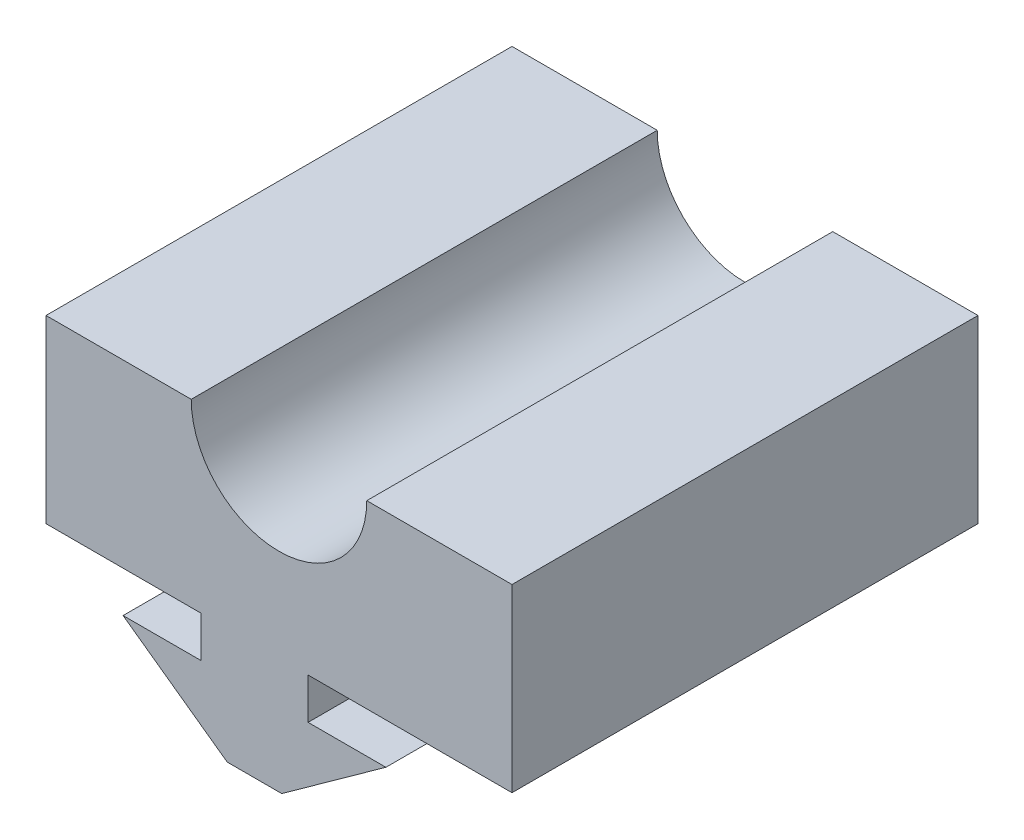
ISO-10303-21;
HEADER;
FILE_DESCRIPTION(('STEP AP214'),'2;1');
FILE_NAME('part.step','',(''),(''),'','','');
FILE_SCHEMA(('AUTOMOTIVE_DESIGN { 1 0 10303 214 1 1 1 1 }'));
ENDSEC;
DATA;
#1=APPLICATION_CONTEXT('core data for automotive mechanical design processes');
#2=APPLICATION_PROTOCOL_DEFINITION('international standard','automotive_design',2000,#1);
#3=PRODUCT_CONTEXT('',#1,'mechanical');
#4=PRODUCT('Part','Part','',(#3));
#5=PRODUCT_RELATED_PRODUCT_CATEGORY('part','',(#4));
#6=PRODUCT_DEFINITION_FORMATION('','',#4);
#7=PRODUCT_DEFINITION_CONTEXT('part definition',#1,'design');
#8=PRODUCT_DEFINITION('design','',#6,#7);
#9=PRODUCT_DEFINITION_SHAPE('','',#8);
#10=(LENGTH_UNIT() NAMED_UNIT(*) SI_UNIT(.MILLI.,.METRE.));
#11=(NAMED_UNIT(*) PLANE_ANGLE_UNIT() SI_UNIT($,.RADIAN.));
#12=(NAMED_UNIT(*) SI_UNIT($,.STERADIAN.) SOLID_ANGLE_UNIT());
#13=UNCERTAINTY_MEASURE_WITH_UNIT(LENGTH_MEASURE(1.E-05),#10,'distance_accuracy_value','');
#14=(GEOMETRIC_REPRESENTATION_CONTEXT(3) GLOBAL_UNCERTAINTY_ASSIGNED_CONTEXT((#13)) GLOBAL_UNIT_ASSIGNED_CONTEXT((#10,
#11,#12)) REPRESENTATION_CONTEXT('',''));
#15=CARTESIAN_POINT('',(0.,0.,0.));
#16=DIRECTION('',(0.,0.,1.));
#17=DIRECTION('',(1.,0.,0.));
#18=AXIS2_PLACEMENT_3D('',#15,#16,#17);
#19=CARTESIAN_POINT('',(0.,0.,25.4));
#20=DIRECTION('',(1.,0.,0.));
#21=DIRECTION('',(0.,0.,-1.));
#22=AXIS2_PLACEMENT_3D('',#19,#20,#21);
#23=PLANE('',#22);
#24=DIRECTION('',(0.,-1.,0.));
#25=VECTOR('',#24,1.);
#26=CARTESIAN_POINT('',(0.,0.,0.));
#27=LINE('',#26,#25);
#28=CARTESIAN_POINT('',(0.,9.8294520547945,0.));
#29=VERTEX_POINT('',#28);
#30=CARTESIAN_POINT('',(0.,0.,0.));
#31=VERTEX_POINT('',#30);
#32=EDGE_CURVE('E180',#29,#31,#27,.T.);
#33=ORIENTED_EDGE('',*,*,#32,.T.);
#34=DIRECTION('',(0.,0.,-1.));
#35=VECTOR('',#34,1.);
#36=CARTESIAN_POINT('',(0.,0.,25.4));
#37=LINE('',#36,#35);
#38=CARTESIAN_POINT('',(0.,0.,25.4));
#39=VERTEX_POINT('',#38);
#40=EDGE_CURVE('E11',#39,#31,#37,.T.);
#41=ORIENTED_EDGE('',*,*,#40,.F.);
#42=DIRECTION('',(0.,-1.,0.));
#43=VECTOR('',#42,1.);
#44=CARTESIAN_POINT('',(0.,0.,25.4));
#45=LINE('',#44,#43);
#46=CARTESIAN_POINT('',(0.,9.8294520547945,25.4));
#47=VERTEX_POINT('',#46);
#48=EDGE_CURVE('E220',#47,#39,#45,.T.);
#49=ORIENTED_EDGE('',*,*,#48,.F.);
#50=DIRECTION('',(0.,0.,-1.));
#51=VECTOR('',#50,1.);
#52=CARTESIAN_POINT('',(0.,9.8294520547945,25.4));
#53=LINE('',#52,#51);
#54=EDGE_CURVE('E176',#47,#29,#53,.T.);
#55=ORIENTED_EDGE('',*,*,#54,.T.);
#56=EDGE_LOOP('',(#33,#41,#49,#55));
#57=FACE_BOUND('',#56,.T.);
#58=ADVANCED_FACE('F43',(#57),#23,.F.);
#59=CARTESIAN_POINT('',(0.,0.,25.4));
#60=DIRECTION('',(0.,1.,0.));
#61=DIRECTION('',(0.,0.,1.));
#62=AXIS2_PLACEMENT_3D('',#59,#60,#61);
#63=PLANE('',#62);
#64=DIRECTION('',(1.,0.,0.));
#65=VECTOR('',#64,1.);
#66=CARTESIAN_POINT('',(0.,0.,0.));
#67=LINE('',#66,#65);
#68=CARTESIAN_POINT('',(8.44304869159382,0.,0.));
#69=VERTEX_POINT('',#68);
#70=EDGE_CURVE('E184',#31,#69,#67,.T.);
#71=ORIENTED_EDGE('',*,*,#70,.T.);
#72=DIRECTION('',(0.,0.,-1.));
#73=VECTOR('',#72,1.);
#74=CARTESIAN_POINT('',(8.44304869159382,0.,25.4));
#75=LINE('',#74,#73);
#76=CARTESIAN_POINT('',(8.44304869159382,0.,25.4));
#77=VERTEX_POINT('',#76);
#78=EDGE_CURVE('E52',#77,#69,#75,.T.);
#79=ORIENTED_EDGE('',*,*,#78,.F.);
#80=DIRECTION('',(1.,0.,0.));
#81=VECTOR('',#80,1.);
#82=CARTESIAN_POINT('',(0.,0.,25.4));
#83=LINE('',#82,#81);
#84=EDGE_CURVE('E121',#39,#77,#83,.T.);
#85=ORIENTED_EDGE('',*,*,#84,.F.);
#86=ORIENTED_EDGE('',*,*,#40,.T.);
#87=EDGE_LOOP('',(#71,#79,#85,#86));
#88=FACE_BOUND('',#87,.T.);
#89=ADVANCED_FACE('F328',(#88),#63,.F.);
#90=CARTESIAN_POINT('',(8.44304869159382,-2.2352,25.4));
#91=DIRECTION('',(1.,0.,0.));
#92=DIRECTION('',(0.,1.,0.));
#93=AXIS2_PLACEMENT_3D('',#90,#91,#92);
#94=PLANE('',#93);
#95=DIRECTION('',(0.,-1.,0.));
#96=VECTOR('',#95,1.);
#97=CARTESIAN_POINT('',(8.44304869159382,-2.2352,0.));
#98=LINE('',#97,#96);
#99=CARTESIAN_POINT('',(8.44304869159382,-2.2352,0.));
#100=VERTEX_POINT('',#99);
#101=EDGE_CURVE('E187',#69,#100,#98,.T.);
#102=ORIENTED_EDGE('',*,*,#101,.T.);
#103=DIRECTION('',(0.,0.,-1.));
#104=VECTOR('',#103,1.);
#105=CARTESIAN_POINT('',(8.44304869159382,-2.2352,25.4));
#106=LINE('',#105,#104);
#107=CARTESIAN_POINT('',(8.44304869159382,-2.2352,25.4));
#108=VERTEX_POINT('',#107);
#109=EDGE_CURVE('E255',#108,#100,#106,.T.);
#110=ORIENTED_EDGE('',*,*,#109,.F.);
#111=DIRECTION('',(0.,-1.,0.));
#112=VECTOR('',#111,1.);
#113=CARTESIAN_POINT('',(8.44304869159382,-2.2352,25.4));
#114=LINE('',#113,#112);
#115=EDGE_CURVE('E265',#77,#108,#114,.T.);
#116=ORIENTED_EDGE('',*,*,#115,.F.);
#117=ORIENTED_EDGE('',*,*,#78,.T.);
#118=EDGE_LOOP('',(#102,#110,#116,#117));
#119=FACE_BOUND('',#118,.T.);
#120=ADVANCED_FACE('F263',(#119),#94,.F.);
#121=CARTESIAN_POINT('',(4.20124869159382,-2.2352,25.4));
#122=DIRECTION('',(0.,-1.,0.));
#123=DIRECTION('',(0.,0.,-1.));
#124=AXIS2_PLACEMENT_3D('',#121,#122,#123);
#125=PLANE('',#124);
#126=DIRECTION('',(-1.,0.,0.));
#127=VECTOR('',#126,1.);
#128=CARTESIAN_POINT('',(4.20124869159382,-2.2352,0.));
#129=LINE('',#128,#127);
#130=CARTESIAN_POINT('',(4.20124869159382,-2.2352,0.));
#131=VERTEX_POINT('',#130);
#132=EDGE_CURVE('E190',#100,#131,#129,.T.);
#133=ORIENTED_EDGE('',*,*,#132,.T.);
#134=DIRECTION('',(0.,0.,-1.));
#135=VECTOR('',#134,1.);
#136=CARTESIAN_POINT('',(4.20124869159382,-2.2352,25.4));
#137=LINE('',#136,#135);
#138=CARTESIAN_POINT('',(4.20124869159382,-2.2352,25.4));
#139=VERTEX_POINT('',#138);
#140=EDGE_CURVE('E251',#139,#131,#137,.T.);
#141=ORIENTED_EDGE('',*,*,#140,.F.);
#142=DIRECTION('',(-1.,0.,0.));
#143=VECTOR('',#142,1.);
#144=CARTESIAN_POINT('',(4.20124869159382,-2.2352,25.4));
#145=LINE('',#144,#143);
#146=EDGE_CURVE('E284',#108,#139,#145,.T.);
#147=ORIENTED_EDGE('',*,*,#146,.F.);
#148=ORIENTED_EDGE('',*,*,#109,.T.);
#149=EDGE_LOOP('',(#133,#141,#147,#148));
#150=FACE_BOUND('',#149,.T.);
#151=ADVANCED_FACE('F274',(#150),#125,.F.);
#152=CARTESIAN_POINT('',(9.87814869159382,-6.31526088295004,25.4));
#153=DIRECTION('',(0.583616147877776,0.812029674295407,0.));
#154=DIRECTION('',(-0.812029674295408,0.583616147877776,0.));
#155=AXIS2_PLACEMENT_3D('',#152,#153,#154);
#156=PLANE('',#155);
#157=DIRECTION('',(0.812029674295407,-0.583616147877776,0.));
#158=VECTOR('',#157,1.);
#159=CARTESIAN_POINT('',(9.87814869159382,-6.31526088295004,0.));
#160=LINE('',#159,#158);
#161=CARTESIAN_POINT('',(9.87814869159382,-6.31526088295004,0.));
#162=VERTEX_POINT('',#161);
#163=EDGE_CURVE('E193',#131,#162,#160,.T.);
#164=ORIENTED_EDGE('',*,*,#163,.T.);
#165=DIRECTION('',(0.,0.,-1.));
#166=VECTOR('',#165,1.);
#167=CARTESIAN_POINT('',(9.87814869159382,-6.31526088295004,25.4));
#168=LINE('',#167,#166);
#169=CARTESIAN_POINT('',(9.87814869159382,-6.31526088295004,25.4));
#170=VERTEX_POINT('',#169);
#171=EDGE_CURVE('E247',#170,#162,#168,.T.);
#172=ORIENTED_EDGE('',*,*,#171,.F.);
#173=DIRECTION('',(0.812029674295407,-0.583616147877776,0.));
#174=VECTOR('',#173,1.);
#175=CARTESIAN_POINT('',(9.87814869159382,-6.31526088295004,25.4));
#176=LINE('',#175,#174);
#177=EDGE_CURVE('E280',#139,#170,#176,.T.);
#178=ORIENTED_EDGE('',*,*,#177,.F.);
#179=ORIENTED_EDGE('',*,*,#140,.T.);
#180=EDGE_LOOP('',(#164,#172,#178,#179));
#181=FACE_BOUND('',#180,.T.);
#182=ADVANCED_FACE('F278',(#181),#156,.F.);
#183=CARTESIAN_POINT('',(12.8499486915938,-6.31526088295004,25.4));
#184=DIRECTION('',(0.,1.,0.));
#185=DIRECTION('',(0.,0.,1.));
#186=AXIS2_PLACEMENT_3D('',#183,#184,#185);
#187=PLANE('',#186);
#188=DIRECTION('',(1.,0.,0.));
#189=VECTOR('',#188,1.);
#190=CARTESIAN_POINT('',(12.8499486915938,-6.31526088295004,0.));
#191=LINE('',#190,#189);
#192=CARTESIAN_POINT('',(12.8499486915938,-6.31526088295004,0.));
#193=VERTEX_POINT('',#192);
#194=EDGE_CURVE('E196',#162,#193,#191,.T.);
#195=ORIENTED_EDGE('',*,*,#194,.T.);
#196=DIRECTION('',(0.,0.,-1.));
#197=VECTOR('',#196,1.);
#198=CARTESIAN_POINT('',(12.8499486915938,-6.31526088295004,25.4));
#199=LINE('',#198,#197);
#200=CARTESIAN_POINT('',(12.8499486915938,-6.31526088295004,25.4));
#201=VERTEX_POINT('',#200);
#202=EDGE_CURVE('E243',#201,#193,#199,.T.);
#203=ORIENTED_EDGE('',*,*,#202,.F.);
#204=DIRECTION('',(1.,0.,0.));
#205=VECTOR('',#204,1.);
#206=CARTESIAN_POINT('',(12.8499486915938,-6.31526088295004,25.4));
#207=LINE('',#206,#205);
#208=EDGE_CURVE('E283',#170,#201,#207,.T.);
#209=ORIENTED_EDGE('',*,*,#208,.F.);
#210=ORIENTED_EDGE('',*,*,#171,.T.);
#211=EDGE_LOOP('',(#195,#203,#209,#210));
#212=FACE_BOUND('',#211,.T.);
#213=ADVANCED_FACE('F341',(#212),#187,.F.);
#214=CARTESIAN_POINT('',(18.5268486915938,-2.2352,25.4));
#215=DIRECTION('',(-0.583616147877776,0.812029674295407,0.));
#216=DIRECTION('',(-0.812029674295408,-0.583616147877776,0.));
#217=AXIS2_PLACEMENT_3D('',#214,#215,#216);
#218=PLANE('',#217);
#219=DIRECTION('',(0.812029674295407,0.583616147877776,0.));
#220=VECTOR('',#219,1.);
#221=CARTESIAN_POINT('',(18.5268486915938,-2.2352,0.));
#222=LINE('',#221,#220);
#223=CARTESIAN_POINT('',(18.5268486915938,-2.2352,0.));
#224=VERTEX_POINT('',#223);
#225=EDGE_CURVE('E199',#193,#224,#222,.T.);
#226=ORIENTED_EDGE('',*,*,#225,.T.);
#227=DIRECTION('',(0.,0.,-1.));
#228=VECTOR('',#227,1.);
#229=CARTESIAN_POINT('',(18.5268486915938,-2.2352,25.4));
#230=LINE('',#229,#228);
#231=CARTESIAN_POINT('',(18.5268486915938,-2.2352,25.4));
#232=VERTEX_POINT('',#231);
#233=EDGE_CURVE('E239',#232,#224,#230,.T.);
#234=ORIENTED_EDGE('',*,*,#233,.F.);
#235=DIRECTION('',(0.812029674295407,0.583616147877776,0.));
#236=VECTOR('',#235,1.);
#237=CARTESIAN_POINT('',(18.5268486915938,-2.2352,25.4));
#238=LINE('',#237,#236);
#239=EDGE_CURVE('E288',#201,#232,#238,.T.);
#240=ORIENTED_EDGE('',*,*,#239,.F.);
#241=ORIENTED_EDGE('',*,*,#202,.T.);
#242=EDGE_LOOP('',(#226,#234,#240,#241));
#243=FACE_BOUND('',#242,.T.);
#244=ADVANCED_FACE('F344',(#243),#218,.F.);
#245=CARTESIAN_POINT('',(14.2850486915938,-2.2352,25.4));
#246=DIRECTION('',(0.,-1.,0.));
#247=DIRECTION('',(0.,0.,-1.));
#248=AXIS2_PLACEMENT_3D('',#245,#246,#247);
#249=PLANE('',#248);
#250=DIRECTION('',(-1.,0.,0.));
#251=VECTOR('',#250,1.);
#252=CARTESIAN_POINT('',(14.2850486915938,-2.2352,0.));
#253=LINE('',#252,#251);
#254=CARTESIAN_POINT('',(14.2850486915938,-2.2352,0.));
#255=VERTEX_POINT('',#254);
#256=EDGE_CURVE('E202',#224,#255,#253,.T.);
#257=ORIENTED_EDGE('',*,*,#256,.T.);
#258=DIRECTION('',(0.,0.,-1.));
#259=VECTOR('',#258,1.);
#260=CARTESIAN_POINT('',(14.2850486915938,-2.2352,25.4));
#261=LINE('',#260,#259);
#262=CARTESIAN_POINT('',(14.2850486915938,-2.2352,25.4));
#263=VERTEX_POINT('',#262);
#264=EDGE_CURVE('E235',#263,#255,#261,.T.);
#265=ORIENTED_EDGE('',*,*,#264,.F.);
#266=DIRECTION('',(-1.,0.,0.));
#267=VECTOR('',#266,1.);
#268=CARTESIAN_POINT('',(14.2850486915938,-2.2352,25.4));
#269=LINE('',#268,#267);
#270=EDGE_CURVE('E295',#232,#263,#269,.T.);
#271=ORIENTED_EDGE('',*,*,#270,.F.);
#272=ORIENTED_EDGE('',*,*,#233,.T.);
#273=EDGE_LOOP('',(#257,#265,#271,#272));
#274=FACE_BOUND('',#273,.T.);
#275=ADVANCED_FACE('F348',(#274),#249,.F.);
#276=CARTESIAN_POINT('',(14.2850486915938,0.,25.4));
#277=DIRECTION('',(-1.,0.,0.));
#278=DIRECTION('',(0.,-1.,0.));
#279=AXIS2_PLACEMENT_3D('',#276,#277,#278);
#280=PLANE('',#279);
#281=DIRECTION('',(0.,1.,0.));
#282=VECTOR('',#281,1.);
#283=CARTESIAN_POINT('',(14.2850486915938,0.,0.));
#284=LINE('',#283,#282);
#285=CARTESIAN_POINT('',(14.2850486915938,0.,0.));
#286=VERTEX_POINT('',#285);
#287=EDGE_CURVE('E205',#255,#286,#284,.T.);
#288=ORIENTED_EDGE('',*,*,#287,.T.);
#289=DIRECTION('',(0.,0.,-1.));
#290=VECTOR('',#289,1.);
#291=CARTESIAN_POINT('',(14.2850486915938,0.,25.4));
#292=LINE('',#291,#290);
#293=CARTESIAN_POINT('',(14.2850486915938,0.,25.4));
#294=VERTEX_POINT('',#293);
#295=EDGE_CURVE('E231',#294,#286,#292,.T.);
#296=ORIENTED_EDGE('',*,*,#295,.F.);
#297=DIRECTION('',(0.,1.,0.));
#298=VECTOR('',#297,1.);
#299=CARTESIAN_POINT('',(14.2850486915938,0.,25.4));
#300=LINE('',#299,#298);
#301=EDGE_CURVE('E298',#263,#294,#300,.T.);
#302=ORIENTED_EDGE('',*,*,#301,.F.);
#303=ORIENTED_EDGE('',*,*,#264,.T.);
#304=EDGE_LOOP('',(#288,#296,#302,#303));
#305=FACE_BOUND('',#304,.T.);
#306=ADVANCED_FACE('F352',(#305),#280,.F.);
#307=CARTESIAN_POINT('',(25.4,0.,25.4));
#308=DIRECTION('',(0.,1.,0.));
#309=DIRECTION('',(0.,0.,1.));
#310=AXIS2_PLACEMENT_3D('',#307,#308,#309);
#311=PLANE('',#310);
#312=DIRECTION('',(1.,0.,0.));
#313=VECTOR('',#312,1.);
#314=CARTESIAN_POINT('',(25.4,0.,0.));
#315=LINE('',#314,#313);
#316=CARTESIAN_POINT('',(25.4,0.,0.));
#317=VERTEX_POINT('',#316);
#318=EDGE_CURVE('E208',#286,#317,#315,.T.);
#319=ORIENTED_EDGE('',*,*,#318,.T.);
#320=DIRECTION('',(0.,0.,-1.));
#321=VECTOR('',#320,1.);
#322=CARTESIAN_POINT('',(25.4,0.,25.4));
#323=LINE('',#322,#321);
#324=CARTESIAN_POINT('',(25.4,0.,25.4));
#325=VERTEX_POINT('',#324);
#326=EDGE_CURVE('E227',#325,#317,#323,.T.);
#327=ORIENTED_EDGE('',*,*,#326,.F.);
#328=DIRECTION('',(1.,0.,0.));
#329=VECTOR('',#328,1.);
#330=CARTESIAN_POINT('',(25.4,0.,25.4));
#331=LINE('',#330,#329);
#332=EDGE_CURVE('E301',#294,#325,#331,.T.);
#333=ORIENTED_EDGE('',*,*,#332,.F.);
#334=ORIENTED_EDGE('',*,*,#295,.T.);
#335=EDGE_LOOP('',(#319,#327,#333,#334));
#336=FACE_BOUND('',#335,.T.);
#337=ADVANCED_FACE('F309',(#336),#311,.F.);
#338=CARTESIAN_POINT('',(25.4,0.,25.4));
#339=DIRECTION('',(-1.,0.,0.));
#340=DIRECTION('',(0.,0.,1.));
#341=AXIS2_PLACEMENT_3D('',#338,#339,#340);
#342=PLANE('',#341);
#343=DIRECTION('',(0.,1.,0.));
#344=VECTOR('',#343,1.);
#345=CARTESIAN_POINT('',(25.4,0.,0.));
#346=LINE('',#345,#344);
#347=CARTESIAN_POINT('',(25.4,9.8294520547945,0.));
#348=VERTEX_POINT('',#347);
#349=EDGE_CURVE('E211',#317,#348,#346,.T.);
#350=ORIENTED_EDGE('',*,*,#349,.T.);
#351=DIRECTION('',(0.,0.,-1.));
#352=VECTOR('',#351,1.);
#353=CARTESIAN_POINT('',(25.4,9.8294520547945,25.4));
#354=LINE('',#353,#352);
#355=CARTESIAN_POINT('',(25.4,9.8294520547945,25.4));
#356=VERTEX_POINT('',#355);
#357=EDGE_CURVE('E169',#356,#348,#354,.T.);
#358=ORIENTED_EDGE('',*,*,#357,.F.);
#359=DIRECTION('',(0.,1.,0.));
#360=VECTOR('',#359,1.);
#361=CARTESIAN_POINT('',(25.4,0.,25.4));
#362=LINE('',#361,#360);
#363=EDGE_CURVE('E158',#325,#356,#362,.T.);
#364=ORIENTED_EDGE('',*,*,#363,.F.);
#365=ORIENTED_EDGE('',*,*,#326,.T.);
#366=EDGE_LOOP('',(#350,#358,#364,#365));
#367=FACE_BOUND('',#366,.T.);
#368=ADVANCED_FACE('F313',(#367),#342,.F.);
#369=CARTESIAN_POINT('',(17.4842465753425,9.8294520547945,25.4));
#370=DIRECTION('',(0.,-1.,0.));
#371=DIRECTION('',(0.,0.,-1.));
#372=AXIS2_PLACEMENT_3D('',#369,#370,#371);
#373=PLANE('',#372);
#374=DIRECTION('',(-1.,0.,0.));
#375=VECTOR('',#374,1.);
#376=CARTESIAN_POINT('',(17.4842465753425,9.8294520547945,0.));
#377=LINE('',#376,#375);
#378=CARTESIAN_POINT('',(17.4842465753425,9.8294520547945,0.));
#379=VERTEX_POINT('',#378);
#380=EDGE_CURVE('E167',#348,#379,#377,.T.);
#381=ORIENTED_EDGE('',*,*,#380,.T.);
#382=DIRECTION('',(0.,0.,-1.));
#383=VECTOR('',#382,1.);
#384=CARTESIAN_POINT('',(17.4842465753425,9.8294520547945,25.4));
#385=LINE('',#384,#383);
#386=CARTESIAN_POINT('',(17.4842465753425,9.8294520547945,25.4));
#387=VERTEX_POINT('',#386);
#388=EDGE_CURVE('E164',#387,#379,#385,.T.);
#389=ORIENTED_EDGE('',*,*,#388,.F.);
#390=DIRECTION('',(-1.,0.,0.));
#391=VECTOR('',#390,1.);
#392=CARTESIAN_POINT('',(17.4842465753425,9.8294520547945,25.4));
#393=LINE('',#392,#391);
#394=EDGE_CURVE('E152',#356,#387,#393,.T.);
#395=ORIENTED_EDGE('',*,*,#394,.F.);
#396=ORIENTED_EDGE('',*,*,#357,.T.);
#397=EDGE_LOOP('',(#381,#389,#395,#396));
#398=FACE_BOUND('',#397,.T.);
#399=ADVANCED_FACE('F165',(#398),#373,.F.);
#400=CARTESIAN_POINT('',(12.7,9.8294520547945,25.4));
#401=DIRECTION('',(0.,0.,-1.));
#402=DIRECTION('',(-1.,0.,0.));
#403=AXIS2_PLACEMENT_3D('',#400,#401,#402);
#404=CYLINDRICAL_SURFACE('',#403,4.78424657534247);
#405=CARTESIAN_POINT('',(12.7,9.8294520547945,0.));
#406=DIRECTION('',(0.,0.,-1.));
#407=DIRECTION('',(1.,0.,0.));
#408=AXIS2_PLACEMENT_3D('',#405,#406,#407);
#409=CIRCLE('',#408,4.78424657534247);
#410=CARTESIAN_POINT('',(7.91575342465753,9.8294520547945,0.));
#411=VERTEX_POINT('',#410);
#412=EDGE_CURVE('E107',#379,#411,#409,.T.);
#413=ORIENTED_EDGE('',*,*,#412,.T.);
#414=DIRECTION('',(0.,0.,-1.));
#415=VECTOR('',#414,1.);
#416=CARTESIAN_POINT('',(7.91575342465753,9.8294520547945,25.4));
#417=LINE('',#416,#415);
#418=CARTESIAN_POINT('',(7.91575342465753,9.8294520547945,25.4));
#419=VERTEX_POINT('',#418);
#420=EDGE_CURVE('E170',#419,#411,#417,.T.);
#421=ORIENTED_EDGE('',*,*,#420,.F.);
#422=CARTESIAN_POINT('',(12.7,9.8294520547945,25.4));
#423=DIRECTION('',(0.,0.,-1.));
#424=DIRECTION('',(1.,0.,0.));
#425=AXIS2_PLACEMENT_3D('',#422,#423,#424);
#426=CIRCLE('',#425,4.78424657534247);
#427=EDGE_CURVE('E156',#387,#419,#426,.T.);
#428=ORIENTED_EDGE('',*,*,#427,.F.);
#429=ORIENTED_EDGE('',*,*,#388,.T.);
#430=EDGE_LOOP('',(#413,#421,#428,#429));
#431=FACE_BOUND('',#430,.T.);
#432=ADVANCED_FACE('F172',(#431),#404,.F.);
#433=CARTESIAN_POINT('',(0.,9.8294520547945,25.4));
#434=DIRECTION('',(0.,-1.,0.));
#435=DIRECTION('',(0.,0.,-1.));
#436=AXIS2_PLACEMENT_3D('',#433,#434,#435);
#437=PLANE('',#436);
#438=DIRECTION('',(-1.,0.,0.));
#439=VECTOR('',#438,1.);
#440=CARTESIAN_POINT('',(0.,9.8294520547945,0.));
#441=LINE('',#440,#439);
#442=EDGE_CURVE('E113',#411,#29,#441,.T.);
#443=ORIENTED_EDGE('',*,*,#442,.T.);
#444=ORIENTED_EDGE('',*,*,#54,.F.);
#445=DIRECTION('',(-1.,0.,0.));
#446=VECTOR('',#445,1.);
#447=CARTESIAN_POINT('',(0.,9.8294520547945,25.4));
#448=LINE('',#447,#446);
#449=EDGE_CURVE('E60',#419,#47,#448,.T.);
#450=ORIENTED_EDGE('',*,*,#449,.F.);
#451=ORIENTED_EDGE('',*,*,#420,.T.);
#452=EDGE_LOOP('',(#443,#444,#450,#451));
#453=FACE_BOUND('',#452,.T.);
#454=ADVANCED_FACE('F317',(#453),#437,.F.);
#455=CARTESIAN_POINT('',(12.7,9.8294520547945,25.4));
#456=DIRECTION('',(0.,0.,1.));
#457=DIRECTION('',(1.,0.,0.));
#458=AXIS2_PLACEMENT_3D('',#455,#456,#457);
#459=PLANE('',#458);
#460=ORIENTED_EDGE('',*,*,#48,.T.);
#461=ORIENTED_EDGE('',*,*,#84,.T.);
#462=ORIENTED_EDGE('',*,*,#115,.T.);
#463=ORIENTED_EDGE('',*,*,#146,.T.);
#464=ORIENTED_EDGE('',*,*,#177,.T.);
#465=ORIENTED_EDGE('',*,*,#208,.T.);
#466=ORIENTED_EDGE('',*,*,#239,.T.);
#467=ORIENTED_EDGE('',*,*,#270,.T.);
#468=ORIENTED_EDGE('',*,*,#301,.T.);
#469=ORIENTED_EDGE('',*,*,#332,.T.);
#470=ORIENTED_EDGE('',*,*,#363,.T.);
#471=ORIENTED_EDGE('',*,*,#394,.T.);
#472=ORIENTED_EDGE('',*,*,#427,.T.);
#473=ORIENTED_EDGE('',*,*,#449,.T.);
#474=EDGE_LOOP('',(#460,#461,#462,#463,#464,#465,#466,#467,#468,#469,#470,#471,#472,#473));
#475=FACE_BOUND('',#474,.T.);
#476=ADVANCED_FACE('F154',(#475),#459,.T.);
#477=CARTESIAN_POINT('',(12.7,9.8294520547945,0.));
#478=DIRECTION('',(0.,0.,1.));
#479=DIRECTION('',(1.,0.,0.));
#480=AXIS2_PLACEMENT_3D('',#477,#478,#479);
#481=PLANE('',#480);
#482=ORIENTED_EDGE('',*,*,#32,.F.);
#483=ORIENTED_EDGE('',*,*,#442,.F.);
#484=ORIENTED_EDGE('',*,*,#412,.F.);
#485=ORIENTED_EDGE('',*,*,#380,.F.);
#486=ORIENTED_EDGE('',*,*,#349,.F.);
#487=ORIENTED_EDGE('',*,*,#318,.F.);
#488=ORIENTED_EDGE('',*,*,#287,.F.);
#489=ORIENTED_EDGE('',*,*,#256,.F.);
#490=ORIENTED_EDGE('',*,*,#225,.F.);
#491=ORIENTED_EDGE('',*,*,#194,.F.);
#492=ORIENTED_EDGE('',*,*,#163,.F.);
#493=ORIENTED_EDGE('',*,*,#132,.F.);
#494=ORIENTED_EDGE('',*,*,#101,.F.);
#495=ORIENTED_EDGE('',*,*,#70,.F.);
#496=EDGE_LOOP('',(#482,#483,#484,#485,#486,#487,#488,#489,#490,#491,#492,#493,#494,#495));
#497=FACE_BOUND('',#496,.T.);
#498=ADVANCED_FACE('F269',(#497),#481,.F.);
#499=CLOSED_SHELL('',(#58,#89,#120,#151,#182,#213,#244,#275,#306,#337,#368,#399,#432,#454,#476,#498));
#500=MANIFOLD_SOLID_BREP('B2',#499);
#501=ADVANCED_BREP_SHAPE_REPRESENTATION('',(#18,#500),#14);
#502=SHAPE_DEFINITION_REPRESENTATION(#9,#501);
ENDSEC;
END-ISO-10303-21;
